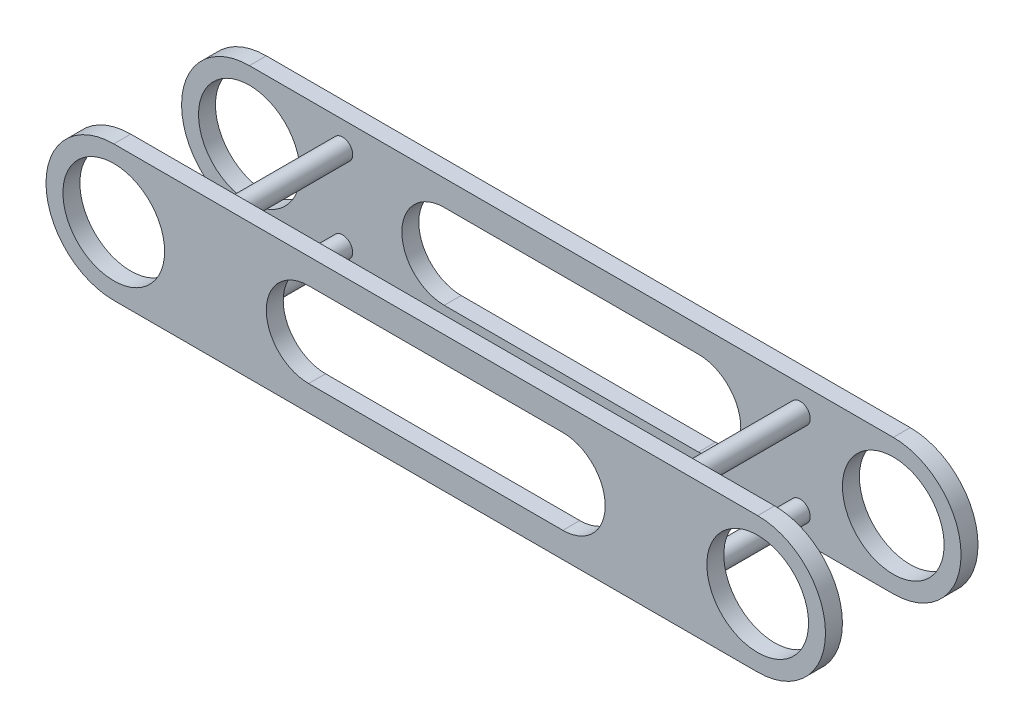
ISO-10303-21;
HEADER;
FILE_DESCRIPTION(('STEP AP214'),'2;1');
FILE_NAME('part.step','',(''),(''),'','','');
FILE_SCHEMA(('AUTOMOTIVE_DESIGN { 1 0 10303 214 1 1 1 1 }'));
ENDSEC;
DATA;
#1=APPLICATION_CONTEXT('core data for automotive mechanical design processes');
#2=APPLICATION_PROTOCOL_DEFINITION('international standard','automotive_design',2000,#1);
#3=PRODUCT_CONTEXT('',#1,'mechanical');
#4=PRODUCT('Part','Part','',(#3));
#5=PRODUCT_RELATED_PRODUCT_CATEGORY('part','',(#4));
#6=PRODUCT_DEFINITION_FORMATION('','',#4);
#7=PRODUCT_DEFINITION_CONTEXT('part definition',#1,'design');
#8=PRODUCT_DEFINITION('design','',#6,#7);
#9=PRODUCT_DEFINITION_SHAPE('','',#8);
#10=(LENGTH_UNIT() NAMED_UNIT(*) SI_UNIT(.MILLI.,.METRE.));
#11=(NAMED_UNIT(*) PLANE_ANGLE_UNIT() SI_UNIT($,.RADIAN.));
#12=(NAMED_UNIT(*) SI_UNIT($,.STERADIAN.) SOLID_ANGLE_UNIT());
#13=UNCERTAINTY_MEASURE_WITH_UNIT(LENGTH_MEASURE(1.E-05),#10,'distance_accuracy_value','');
#14=(GEOMETRIC_REPRESENTATION_CONTEXT(3) GLOBAL_UNCERTAINTY_ASSIGNED_CONTEXT((#13)) GLOBAL_UNIT_ASSIGNED_CONTEXT((#10,
#11,#12)) REPRESENTATION_CONTEXT('',''));
#15=CARTESIAN_POINT('',(0.,0.,0.));
#16=DIRECTION('',(0.,0.,1.));
#17=DIRECTION('',(1.,0.,0.));
#18=AXIS2_PLACEMENT_3D('',#15,#16,#17);
#19=CARTESIAN_POINT('',(380.,0.,-35.));
#20=DIRECTION('',(0.,0.,-1.));
#21=DIRECTION('',(1.,0.,0.));
#22=AXIS2_PLACEMENT_3D('',#19,#20,#21);
#23=PLANE('',#22);
#24=CARTESIAN_POINT('',(325.,25.,-35.));
#25=DIRECTION('',(0.,0.,-1.));
#26=DIRECTION('',(-1.,0.,0.));
#27=AXIS2_PLACEMENT_3D('',#24,#25,#26);
#28=CIRCLE('',#27,5.99999999999999);
#29=CARTESIAN_POINT('',(319.,25.,-35.));
#30=VERTEX_POINT('',#29);
#31=EDGE_CURVE('E433',#30,#30,#28,.F.);
#32=ORIENTED_EDGE('',*,*,#31,.F.);
#33=EDGE_LOOP('',(#32));
#34=FACE_BOUND('',#33,.T.);
#35=CARTESIAN_POINT('',(325.,-25.,-35.));
#36=DIRECTION('',(0.,0.,-1.));
#37=DIRECTION('',(-1.,0.,0.));
#38=AXIS2_PLACEMENT_3D('',#35,#36,#37);
#39=CIRCLE('',#38,5.99999999999999);
#40=CARTESIAN_POINT('',(319.,-25.,-35.));
#41=VERTEX_POINT('',#40);
#42=EDGE_CURVE('E441',#41,#41,#39,.F.);
#43=ORIENTED_EDGE('',*,*,#42,.F.);
#44=EDGE_LOOP('',(#43));
#45=FACE_BOUND('',#44,.T.);
#46=CARTESIAN_POINT('',(55.,-25.,-35.));
#47=DIRECTION('',(0.,0.,-1.));
#48=DIRECTION('',(-1.,0.,0.));
#49=AXIS2_PLACEMENT_3D('',#46,#47,#48);
#50=CIRCLE('',#49,6.);
#51=CARTESIAN_POINT('',(49.,-25.,-35.));
#52=VERTEX_POINT('',#51);
#53=EDGE_CURVE('E449',#52,#52,#50,.F.);
#54=ORIENTED_EDGE('',*,*,#53,.F.);
#55=EDGE_LOOP('',(#54));
#56=FACE_BOUND('',#55,.T.);
#57=CARTESIAN_POINT('',(55.,25.,-35.));
#58=DIRECTION('',(0.,0.,-1.));
#59=DIRECTION('',(-1.,0.,0.));
#60=AXIS2_PLACEMENT_3D('',#57,#58,#59);
#61=CIRCLE('',#60,6.);
#62=CARTESIAN_POINT('',(49.,25.,-35.));
#63=VERTEX_POINT('',#62);
#64=EDGE_CURVE('E457',#63,#63,#61,.F.);
#65=ORIENTED_EDGE('',*,*,#64,.F.);
#66=EDGE_LOOP('',(#65));
#67=FACE_BOUND('',#66,.T.);
#68=CARTESIAN_POINT('',(380.,0.,-35.));
#69=DIRECTION('',(0.,0.,1.));
#70=DIRECTION('',(1.,0.,0.));
#71=AXIS2_PLACEMENT_3D('',#68,#69,#70);
#72=CIRCLE('',#71,40.);
#73=CARTESIAN_POINT('',(380.,-40.,-35.));
#74=VERTEX_POINT('',#73);
#75=CARTESIAN_POINT('',(380.,40.,-35.));
#76=VERTEX_POINT('',#75);
#77=EDGE_CURVE('E201',#74,#76,#72,.T.);
#78=ORIENTED_EDGE('',*,*,#77,.T.);
#79=DIRECTION('',(-1.,0.,0.));
#80=VECTOR('',#79,1.);
#81=CARTESIAN_POINT('',(0.,40.,-35.));
#82=LINE('',#81,#80);
#83=CARTESIAN_POINT('',(0.,40.,-35.));
#84=VERTEX_POINT('',#83);
#85=EDGE_CURVE('E212',#76,#84,#82,.T.);
#86=ORIENTED_EDGE('',*,*,#85,.T.);
#87=CARTESIAN_POINT('',(0.,0.,-35.));
#88=DIRECTION('',(0.,0.,1.));
#89=DIRECTION('',(1.,0.,0.));
#90=AXIS2_PLACEMENT_3D('',#87,#88,#89);
#91=CIRCLE('',#90,40.);
#92=CARTESIAN_POINT('',(0.,-40.,-35.));
#93=VERTEX_POINT('',#92);
#94=EDGE_CURVE('E209',#84,#93,#91,.T.);
#95=ORIENTED_EDGE('',*,*,#94,.T.);
#96=DIRECTION('',(1.,0.,0.));
#97=VECTOR('',#96,1.);
#98=CARTESIAN_POINT('',(0.,-40.,-35.));
#99=LINE('',#98,#97);
#100=EDGE_CURVE('E205',#93,#74,#99,.T.);
#101=ORIENTED_EDGE('',*,*,#100,.T.);
#102=EDGE_LOOP('',(#78,#86,#95,#101));
#103=FACE_BOUND('',#102,.T.);
#104=CARTESIAN_POINT('',(380.,0.,-35.));
#105=DIRECTION('',(0.,0.,-1.));
#106=DIRECTION('',(-1.,0.,0.));
#107=AXIS2_PLACEMENT_3D('',#104,#105,#106);
#108=CIRCLE('',#107,30.);
#109=CARTESIAN_POINT('',(350.,0.,-35.));
#110=VERTEX_POINT('',#109);
#111=EDGE_CURVE('E414',#110,#110,#108,.T.);
#112=ORIENTED_EDGE('',*,*,#111,.T.);
#113=EDGE_LOOP('',(#112));
#114=FACE_BOUND('',#113,.T.);
#115=CARTESIAN_POINT('',(0.,0.,-35.));
#116=DIRECTION('',(0.,0.,-1.));
#117=DIRECTION('',(-1.,0.,0.));
#118=AXIS2_PLACEMENT_3D('',#115,#116,#117);
#119=CIRCLE('',#118,30.);
#120=CARTESIAN_POINT('',(-30.,0.,-35.));
#121=VERTEX_POINT('',#120);
#122=EDGE_CURVE('E429',#121,#121,#119,.T.);
#123=ORIENTED_EDGE('',*,*,#122,.T.);
#124=EDGE_LOOP('',(#123));
#125=FACE_BOUND('',#124,.T.);
#126=CARTESIAN_POINT('',(265.,0.,-35.));
#127=DIRECTION('',(0.,0.,-1.));
#128=DIRECTION('',(-1.,0.,0.));
#129=AXIS2_PLACEMENT_3D('',#126,#127,#128);
#130=CIRCLE('',#129,25.);
#131=CARTESIAN_POINT('',(265.,25.,-35.));
#132=VERTEX_POINT('',#131);
#133=CARTESIAN_POINT('',(265.,-25.,-35.));
#134=VERTEX_POINT('',#133);
#135=EDGE_CURVE('E168',#132,#134,#130,.T.);
#136=ORIENTED_EDGE('',*,*,#135,.T.);
#137=DIRECTION('',(-1.,0.,0.));
#138=VECTOR('',#137,1.);
#139=CARTESIAN_POINT('',(265.,-25.,-35.));
#140=LINE('',#139,#138);
#141=CARTESIAN_POINT('',(115.,-25.0000000000001,-35.));
#142=VERTEX_POINT('',#141);
#143=EDGE_CURVE('E156',#134,#142,#140,.T.);
#144=ORIENTED_EDGE('',*,*,#143,.T.);
#145=CARTESIAN_POINT('',(115.,0.,-35.));
#146=DIRECTION('',(0.,0.,-1.));
#147=DIRECTION('',(-1.,0.,0.));
#148=AXIS2_PLACEMENT_3D('',#145,#146,#147);
#149=CIRCLE('',#148,25.);
#150=CARTESIAN_POINT('',(115.,25.,-35.));
#151=VERTEX_POINT('',#150);
#152=EDGE_CURVE('E181',#142,#151,#149,.T.);
#153=ORIENTED_EDGE('',*,*,#152,.T.);
#154=DIRECTION('',(1.,0.,0.));
#155=VECTOR('',#154,1.);
#156=CARTESIAN_POINT('',(265.,25.,-35.));
#157=LINE('',#156,#155);
#158=EDGE_CURVE('E174',#151,#132,#157,.T.);
#159=ORIENTED_EDGE('',*,*,#158,.T.);
#160=EDGE_LOOP('',(#136,#144,#153,#159));
#161=FACE_BOUND('',#160,.T.);
#162=ADVANCED_FACE('F42',(#34,#45,#56,#67,#103,#114,#125,#161),#23,.F.);
#163=CARTESIAN_POINT('',(380.,0.,-45.));
#164=DIRECTION('',(0.,0.,-1.));
#165=DIRECTION('',(1.,0.,0.));
#166=AXIS2_PLACEMENT_3D('',#163,#164,#165);
#167=PLANE('',#166);
#168=CARTESIAN_POINT('',(0.,0.,-45.));
#169=DIRECTION('',(0.,0.,-1.));
#170=DIRECTION('',(-1.,0.,0.));
#171=AXIS2_PLACEMENT_3D('',#168,#169,#170);
#172=CIRCLE('',#171,30.);
#173=CARTESIAN_POINT('',(-30.,0.,-45.));
#174=VERTEX_POINT('',#173);
#175=EDGE_CURVE('E419',#174,#174,#172,.T.);
#176=ORIENTED_EDGE('',*,*,#175,.F.);
#177=EDGE_LOOP('',(#176));
#178=FACE_BOUND('',#177,.T.);
#179=CARTESIAN_POINT('',(380.,0.,-45.));
#180=DIRECTION('',(0.,0.,-1.));
#181=DIRECTION('',(-1.,0.,0.));
#182=AXIS2_PLACEMENT_3D('',#179,#180,#181);
#183=CIRCLE('',#182,30.);
#184=CARTESIAN_POINT('',(350.,0.,-45.));
#185=VERTEX_POINT('',#184);
#186=EDGE_CURVE('E422',#185,#185,#183,.T.);
#187=ORIENTED_EDGE('',*,*,#186,.F.);
#188=EDGE_LOOP('',(#187));
#189=FACE_BOUND('',#188,.T.);
#190=CARTESIAN_POINT('',(380.,0.,-45.));
#191=DIRECTION('',(0.,0.,1.));
#192=DIRECTION('',(1.,0.,0.));
#193=AXIS2_PLACEMENT_3D('',#190,#191,#192);
#194=CIRCLE('',#193,40.);
#195=CARTESIAN_POINT('',(380.,-40.,-45.));
#196=VERTEX_POINT('',#195);
#197=CARTESIAN_POINT('',(380.,40.,-45.));
#198=VERTEX_POINT('',#197);
#199=EDGE_CURVE('E164',#196,#198,#194,.T.);
#200=ORIENTED_EDGE('',*,*,#199,.F.);
#201=DIRECTION('',(1.,0.,0.));
#202=VECTOR('',#201,1.);
#203=CARTESIAN_POINT('',(0.,-40.,-45.));
#204=LINE('',#203,#202);
#205=CARTESIAN_POINT('',(0.,-40.,-45.));
#206=VERTEX_POINT('',#205);
#207=EDGE_CURVE('E219',#206,#196,#204,.T.);
#208=ORIENTED_EDGE('',*,*,#207,.F.);
#209=CARTESIAN_POINT('',(0.,0.,-45.));
#210=DIRECTION('',(0.,0.,1.));
#211=DIRECTION('',(1.,0.,0.));
#212=AXIS2_PLACEMENT_3D('',#209,#210,#211);
#213=CIRCLE('',#212,40.);
#214=CARTESIAN_POINT('',(0.,40.,-45.));
#215=VERTEX_POINT('',#214);
#216=EDGE_CURVE('E222',#215,#206,#213,.T.);
#217=ORIENTED_EDGE('',*,*,#216,.F.);
#218=DIRECTION('',(-1.,0.,0.));
#219=VECTOR('',#218,1.);
#220=CARTESIAN_POINT('',(0.,40.,-45.));
#221=LINE('',#220,#219);
#222=EDGE_CURVE('E206',#198,#215,#221,.T.);
#223=ORIENTED_EDGE('',*,*,#222,.F.);
#224=EDGE_LOOP('',(#200,#208,#217,#223));
#225=FACE_BOUND('',#224,.T.);
#226=DIRECTION('',(1.,0.,0.));
#227=VECTOR('',#226,1.);
#228=CARTESIAN_POINT('',(265.,-25.,-45.));
#229=LINE('',#228,#227);
#230=CARTESIAN_POINT('',(115.,-25.0000000000001,-45.));
#231=VERTEX_POINT('',#230);
#232=CARTESIAN_POINT('',(265.,-25.,-45.));
#233=VERTEX_POINT('',#232);
#234=EDGE_CURVE('E179',#231,#233,#229,.T.);
#235=ORIENTED_EDGE('',*,*,#234,.T.);
#236=CARTESIAN_POINT('',(265.,0.,-45.));
#237=DIRECTION('',(0.,0.,1.));
#238=DIRECTION('',(1.,0.,0.));
#239=AXIS2_PLACEMENT_3D('',#236,#237,#238);
#240=CIRCLE('',#239,25.);
#241=CARTESIAN_POINT('',(265.,25.,-45.));
#242=VERTEX_POINT('',#241);
#243=EDGE_CURVE('E68',#233,#242,#240,.T.);
#244=ORIENTED_EDGE('',*,*,#243,.T.);
#245=DIRECTION('',(-1.,0.,0.));
#246=VECTOR('',#245,1.);
#247=CARTESIAN_POINT('',(265.,25.,-45.));
#248=LINE('',#247,#246);
#249=CARTESIAN_POINT('',(115.,25.,-45.));
#250=VERTEX_POINT('',#249);
#251=EDGE_CURVE('E171',#242,#250,#248,.T.);
#252=ORIENTED_EDGE('',*,*,#251,.T.);
#253=CARTESIAN_POINT('',(115.,0.,-45.));
#254=DIRECTION('',(0.,0.,1.));
#255=DIRECTION('',(1.,0.,0.));
#256=AXIS2_PLACEMENT_3D('',#253,#254,#255);
#257=CIRCLE('',#256,25.);
#258=EDGE_CURVE('E187',#250,#231,#257,.T.);
#259=ORIENTED_EDGE('',*,*,#258,.T.);
#260=EDGE_LOOP('',(#235,#244,#252,#259));
#261=FACE_BOUND('',#260,.T.);
#262=ADVANCED_FACE('F348',(#178,#189,#225,#261),#167,.T.);
#263=CARTESIAN_POINT('',(380.,0.,35.));
#264=DIRECTION('',(0.,0.,1.));
#265=DIRECTION('',(1.,0.,0.));
#266=AXIS2_PLACEMENT_3D('',#263,#264,#265);
#267=CYLINDRICAL_SURFACE('',#266,40.);
#268=CARTESIAN_POINT('',(380.,0.,45.));
#269=DIRECTION('',(0.,0.,1.));
#270=DIRECTION('',(1.,0.,0.));
#271=AXIS2_PLACEMENT_3D('',#268,#269,#270);
#272=CIRCLE('',#271,40.);
#273=CARTESIAN_POINT('',(380.,-40.,45.));
#274=VERTEX_POINT('',#273);
#275=CARTESIAN_POINT('',(380.,40.,45.));
#276=VERTEX_POINT('',#275);
#277=EDGE_CURVE('E285',#274,#276,#272,.T.);
#278=ORIENTED_EDGE('',*,*,#277,.F.);
#279=DIRECTION('',(0.,0.,1.));
#280=VECTOR('',#279,1.);
#281=CARTESIAN_POINT('',(380.,-40.,35.));
#282=LINE('',#281,#280);
#283=CARTESIAN_POINT('',(380.,-40.,35.));
#284=VERTEX_POINT('',#283);
#285=EDGE_CURVE('E11',#284,#274,#282,.T.);
#286=ORIENTED_EDGE('',*,*,#285,.F.);
#287=CARTESIAN_POINT('',(380.,0.,35.));
#288=DIRECTION('',(0.,0.,1.));
#289=DIRECTION('',(1.,0.,0.));
#290=AXIS2_PLACEMENT_3D('',#287,#288,#289);
#291=CIRCLE('',#290,40.);
#292=CARTESIAN_POINT('',(380.,40.,35.));
#293=VERTEX_POINT('',#292);
#294=EDGE_CURVE('E286',#284,#293,#291,.T.);
#295=ORIENTED_EDGE('',*,*,#294,.T.);
#296=DIRECTION('',(0.,0.,1.));
#297=VECTOR('',#296,1.);
#298=CARTESIAN_POINT('',(380.,40.,35.));
#299=LINE('',#298,#297);
#300=EDGE_CURVE('E46',#293,#276,#299,.T.);
#301=ORIENTED_EDGE('',*,*,#300,.T.);
#302=EDGE_LOOP('',(#278,#286,#295,#301));
#303=FACE_BOUND('',#302,.T.);
#304=ADVANCED_FACE('F44',(#303),#267,.T.);
#305=CARTESIAN_POINT('',(0.,-40.,35.));
#306=DIRECTION('',(0.,-1.,0.));
#307=DIRECTION('',(1.,0.,0.));
#308=AXIS2_PLACEMENT_3D('',#305,#306,#307);
#309=PLANE('',#308);
#310=DIRECTION('',(1.,0.,0.));
#311=VECTOR('',#310,1.);
#312=CARTESIAN_POINT('',(0.,-40.,45.));
#313=LINE('',#312,#311);
#314=CARTESIAN_POINT('',(0.,-40.,45.));
#315=VERTEX_POINT('',#314);
#316=EDGE_CURVE('E291',#315,#274,#313,.T.);
#317=ORIENTED_EDGE('',*,*,#316,.F.);
#318=DIRECTION('',(0.,0.,1.));
#319=VECTOR('',#318,1.);
#320=CARTESIAN_POINT('',(0.,-40.,35.));
#321=LINE('',#320,#319);
#322=CARTESIAN_POINT('',(0.,-40.,35.));
#323=VERTEX_POINT('',#322);
#324=EDGE_CURVE('E52',#323,#315,#321,.T.);
#325=ORIENTED_EDGE('',*,*,#324,.F.);
#326=DIRECTION('',(1.,0.,0.));
#327=VECTOR('',#326,1.);
#328=CARTESIAN_POINT('',(0.,-40.,35.));
#329=LINE('',#328,#327);
#330=EDGE_CURVE('E299',#323,#284,#329,.T.);
#331=ORIENTED_EDGE('',*,*,#330,.T.);
#332=ORIENTED_EDGE('',*,*,#285,.T.);
#333=EDGE_LOOP('',(#317,#325,#331,#332));
#334=FACE_BOUND('',#333,.T.);
#335=ADVANCED_FACE('F333',(#334),#309,.T.);
#336=CARTESIAN_POINT('',(0.,0.,35.));
#337=DIRECTION('',(0.,0.,1.));
#338=DIRECTION('',(1.,0.,0.));
#339=AXIS2_PLACEMENT_3D('',#336,#337,#338);
#340=CYLINDRICAL_SURFACE('',#339,40.);
#341=CARTESIAN_POINT('',(0.,0.,45.));
#342=DIRECTION('',(0.,0.,1.));
#343=DIRECTION('',(1.,0.,0.));
#344=AXIS2_PLACEMENT_3D('',#341,#342,#343);
#345=CIRCLE('',#344,40.);
#346=CARTESIAN_POINT('',(0.,40.,45.));
#347=VERTEX_POINT('',#346);
#348=EDGE_CURVE('E310',#347,#315,#345,.T.);
#349=ORIENTED_EDGE('',*,*,#348,.F.);
#350=DIRECTION('',(0.,0.,1.));
#351=VECTOR('',#350,1.);
#352=CARTESIAN_POINT('',(0.,40.,35.));
#353=LINE('',#352,#351);
#354=CARTESIAN_POINT('',(0.,40.,35.));
#355=VERTEX_POINT('',#354);
#356=EDGE_CURVE('E318',#355,#347,#353,.T.);
#357=ORIENTED_EDGE('',*,*,#356,.F.);
#358=CARTESIAN_POINT('',(0.,0.,35.));
#359=DIRECTION('',(0.,0.,1.));
#360=DIRECTION('',(1.,0.,0.));
#361=AXIS2_PLACEMENT_3D('',#358,#359,#360);
#362=CIRCLE('',#361,40.);
#363=EDGE_CURVE('E295',#355,#323,#362,.T.);
#364=ORIENTED_EDGE('',*,*,#363,.T.);
#365=ORIENTED_EDGE('',*,*,#324,.T.);
#366=EDGE_LOOP('',(#349,#357,#364,#365));
#367=FACE_BOUND('',#366,.T.);
#368=ADVANCED_FACE('F339',(#367),#340,.T.);
#369=CARTESIAN_POINT('',(0.,40.,35.));
#370=DIRECTION('',(0.,1.,0.));
#371=DIRECTION('',(0.,0.,1.));
#372=AXIS2_PLACEMENT_3D('',#369,#370,#371);
#373=PLANE('',#372);
#374=DIRECTION('',(-1.,0.,0.));
#375=VECTOR('',#374,1.);
#376=CARTESIAN_POINT('',(0.,40.,45.));
#377=LINE('',#376,#375);
#378=EDGE_CURVE('E306',#276,#347,#377,.T.);
#379=ORIENTED_EDGE('',*,*,#378,.F.);
#380=ORIENTED_EDGE('',*,*,#300,.F.);
#381=DIRECTION('',(-1.,0.,0.));
#382=VECTOR('',#381,1.);
#383=CARTESIAN_POINT('',(0.,40.,35.));
#384=LINE('',#383,#382);
#385=EDGE_CURVE('E290',#293,#355,#384,.T.);
#386=ORIENTED_EDGE('',*,*,#385,.T.);
#387=ORIENTED_EDGE('',*,*,#356,.T.);
#388=EDGE_LOOP('',(#379,#380,#386,#387));
#389=FACE_BOUND('',#388,.T.);
#390=ADVANCED_FACE('F328',(#389),#373,.T.);
#391=CARTESIAN_POINT('',(380.,0.,35.));
#392=DIRECTION('',(0.,0.,1.));
#393=DIRECTION('',(1.,0.,0.));
#394=AXIS2_PLACEMENT_3D('',#391,#392,#393);
#395=PLANE('',#394);
#396=CARTESIAN_POINT('',(325.,25.,35.));
#397=DIRECTION('',(0.,0.,1.));
#398=DIRECTION('',(1.,0.,0.));
#399=AXIS2_PLACEMENT_3D('',#396,#397,#398);
#400=CIRCLE('',#399,5.99999999999999);
#401=CARTESIAN_POINT('',(331.,25.,35.));
#402=VERTEX_POINT('',#401);
#403=EDGE_CURVE('E437',#402,#402,#400,.T.);
#404=ORIENTED_EDGE('',*,*,#403,.T.);
#405=EDGE_LOOP('',(#404));
#406=FACE_BOUND('',#405,.T.);
#407=CARTESIAN_POINT('',(325.,-25.,35.));
#408=DIRECTION('',(0.,0.,1.));
#409=DIRECTION('',(1.,0.,0.));
#410=AXIS2_PLACEMENT_3D('',#407,#408,#409);
#411=CIRCLE('',#410,5.99999999999999);
#412=CARTESIAN_POINT('',(331.,-25.,35.));
#413=VERTEX_POINT('',#412);
#414=EDGE_CURVE('E445',#413,#413,#411,.T.);
#415=ORIENTED_EDGE('',*,*,#414,.T.);
#416=EDGE_LOOP('',(#415));
#417=FACE_BOUND('',#416,.T.);
#418=CARTESIAN_POINT('',(55.,-25.,35.));
#419=DIRECTION('',(0.,0.,1.));
#420=DIRECTION('',(1.,0.,0.));
#421=AXIS2_PLACEMENT_3D('',#418,#419,#420);
#422=CIRCLE('',#421,6.);
#423=CARTESIAN_POINT('',(61.,-25.,35.));
#424=VERTEX_POINT('',#423);
#425=EDGE_CURVE('E453',#424,#424,#422,.T.);
#426=ORIENTED_EDGE('',*,*,#425,.T.);
#427=EDGE_LOOP('',(#426));
#428=FACE_BOUND('',#427,.T.);
#429=CARTESIAN_POINT('',(55.,25.,35.));
#430=DIRECTION('',(0.,0.,1.));
#431=DIRECTION('',(1.,0.,0.));
#432=AXIS2_PLACEMENT_3D('',#429,#430,#431);
#433=CIRCLE('',#432,6.);
#434=CARTESIAN_POINT('',(61.,25.,35.));
#435=VERTEX_POINT('',#434);
#436=EDGE_CURVE('E461',#435,#435,#433,.T.);
#437=ORIENTED_EDGE('',*,*,#436,.T.);
#438=EDGE_LOOP('',(#437));
#439=FACE_BOUND('',#438,.T.);
#440=CARTESIAN_POINT('',(380.,0.,35.));
#441=DIRECTION('',(0.,0.,1.));
#442=DIRECTION('',(1.,0.,0.));
#443=AXIS2_PLACEMENT_3D('',#440,#441,#442);
#444=CIRCLE('',#443,30.);
#445=CARTESIAN_POINT('',(410.,0.,35.));
#446=VERTEX_POINT('',#445);
#447=EDGE_CURVE('E502',#446,#446,#444,.T.);
#448=ORIENTED_EDGE('',*,*,#447,.T.);
#449=EDGE_LOOP('',(#448));
#450=FACE_BOUND('',#449,.T.);
#451=DIRECTION('',(-1.,0.,0.));
#452=VECTOR('',#451,1.);
#453=CARTESIAN_POINT('',(265.,-25.,35.));
#454=LINE('',#453,#452);
#455=CARTESIAN_POINT('',(265.,-25.,35.));
#456=VERTEX_POINT('',#455);
#457=CARTESIAN_POINT('',(115.,-25.0000000000001,35.));
#458=VERTEX_POINT('',#457);
#459=EDGE_CURVE('E245',#456,#458,#454,.T.);
#460=ORIENTED_EDGE('',*,*,#459,.F.);
#461=CARTESIAN_POINT('',(265.,0.,35.));
#462=DIRECTION('',(0.,0.,1.));
#463=DIRECTION('',(1.,0.,0.));
#464=AXIS2_PLACEMENT_3D('',#461,#462,#463);
#465=CIRCLE('',#464,25.);
#466=CARTESIAN_POINT('',(265.,25.,35.));
#467=VERTEX_POINT('',#466);
#468=EDGE_CURVE('E249',#467,#456,#465,.F.);
#469=ORIENTED_EDGE('',*,*,#468,.F.);
#470=DIRECTION('',(1.,0.,0.));
#471=VECTOR('',#470,1.);
#472=CARTESIAN_POINT('',(265.,25.,35.));
#473=LINE('',#472,#471);
#474=CARTESIAN_POINT('',(115.,25.,35.));
#475=VERTEX_POINT('',#474);
#476=EDGE_CURVE('E272',#475,#467,#473,.T.);
#477=ORIENTED_EDGE('',*,*,#476,.F.);
#478=CARTESIAN_POINT('',(115.,0.,35.));
#479=DIRECTION('',(0.,0.,1.));
#480=DIRECTION('',(1.,0.,0.));
#481=AXIS2_PLACEMENT_3D('',#478,#479,#480);
#482=CIRCLE('',#481,25.);
#483=EDGE_CURVE('E231',#458,#475,#482,.F.);
#484=ORIENTED_EDGE('',*,*,#483,.F.);
#485=EDGE_LOOP('',(#460,#469,#477,#484));
#486=FACE_BOUND('',#485,.T.);
#487=CARTESIAN_POINT('',(0.,0.,35.));
#488=DIRECTION('',(0.,0.,1.));
#489=DIRECTION('',(1.,0.,0.));
#490=AXIS2_PLACEMENT_3D('',#487,#488,#489);
#491=CIRCLE('',#490,30.);
#492=CARTESIAN_POINT('',(30.,0.,35.));
#493=VERTEX_POINT('',#492);
#494=EDGE_CURVE('E413',#493,#493,#491,.T.);
#495=ORIENTED_EDGE('',*,*,#494,.T.);
#496=EDGE_LOOP('',(#495));
#497=FACE_BOUND('',#496,.T.);
#498=ORIENTED_EDGE('',*,*,#294,.F.);
#499=ORIENTED_EDGE('',*,*,#330,.F.);
#500=ORIENTED_EDGE('',*,*,#363,.F.);
#501=ORIENTED_EDGE('',*,*,#385,.F.);
#502=EDGE_LOOP('',(#498,#499,#500,#501));
#503=FACE_BOUND('',#502,.T.);
#504=ADVANCED_FACE('F336',(#406,#417,#428,#439,#450,#486,#497,#503),#395,.F.);
#505=CARTESIAN_POINT('',(380.,0.,45.));
#506=DIRECTION('',(0.,0.,1.));
#507=DIRECTION('',(1.,0.,0.));
#508=AXIS2_PLACEMENT_3D('',#505,#506,#507);
#509=PLANE('',#508);
#510=CARTESIAN_POINT('',(380.,0.,45.));
#511=DIRECTION('',(0.,0.,1.));
#512=DIRECTION('',(1.,0.,0.));
#513=AXIS2_PLACEMENT_3D('',#510,#511,#512);
#514=CIRCLE('',#513,30.);
#515=CARTESIAN_POINT('',(410.,0.,45.));
#516=VERTEX_POINT('',#515);
#517=EDGE_CURVE('E403',#516,#516,#514,.T.);
#518=ORIENTED_EDGE('',*,*,#517,.F.);
#519=EDGE_LOOP('',(#518));
#520=FACE_BOUND('',#519,.T.);
#521=CARTESIAN_POINT('',(265.,0.,45.));
#522=DIRECTION('',(0.,0.,1.));
#523=DIRECTION('',(1.,0.,0.));
#524=AXIS2_PLACEMENT_3D('',#521,#522,#523);
#525=CIRCLE('',#524,25.);
#526=CARTESIAN_POINT('',(265.,-25.,45.));
#527=VERTEX_POINT('',#526);
#528=CARTESIAN_POINT('',(265.,25.,45.));
#529=VERTEX_POINT('',#528);
#530=EDGE_CURVE('E253',#527,#529,#525,.T.);
#531=ORIENTED_EDGE('',*,*,#530,.F.);
#532=DIRECTION('',(1.,0.,0.));
#533=VECTOR('',#532,1.);
#534=CARTESIAN_POINT('',(265.,-25.,45.));
#535=LINE('',#534,#533);
#536=CARTESIAN_POINT('',(115.,-25.0000000000001,45.));
#537=VERTEX_POINT('',#536);
#538=EDGE_CURVE('E264',#537,#527,#535,.T.);
#539=ORIENTED_EDGE('',*,*,#538,.F.);
#540=CARTESIAN_POINT('',(115.,0.,45.));
#541=DIRECTION('',(0.,0.,1.));
#542=DIRECTION('',(1.,0.,0.));
#543=AXIS2_PLACEMENT_3D('',#540,#541,#542);
#544=CIRCLE('',#543,25.);
#545=CARTESIAN_POINT('',(115.,25.,45.));
#546=VERTEX_POINT('',#545);
#547=EDGE_CURVE('E260',#546,#537,#544,.T.);
#548=ORIENTED_EDGE('',*,*,#547,.F.);
#549=DIRECTION('',(-1.,0.,0.));
#550=VECTOR('',#549,1.);
#551=CARTESIAN_POINT('',(265.,25.,45.));
#552=LINE('',#551,#550);
#553=EDGE_CURVE('E256',#529,#546,#552,.T.);
#554=ORIENTED_EDGE('',*,*,#553,.F.);
#555=EDGE_LOOP('',(#531,#539,#548,#554));
#556=FACE_BOUND('',#555,.T.);
#557=CARTESIAN_POINT('',(0.,0.,45.));
#558=DIRECTION('',(0.,0.,1.));
#559=DIRECTION('',(1.,0.,0.));
#560=AXIS2_PLACEMENT_3D('',#557,#558,#559);
#561=CIRCLE('',#560,30.);
#562=CARTESIAN_POINT('',(30.,0.,45.));
#563=VERTEX_POINT('',#562);
#564=EDGE_CURVE('E410',#563,#563,#561,.T.);
#565=ORIENTED_EDGE('',*,*,#564,.F.);
#566=EDGE_LOOP('',(#565));
#567=FACE_BOUND('',#566,.T.);
#568=ORIENTED_EDGE('',*,*,#277,.T.);
#569=ORIENTED_EDGE('',*,*,#378,.T.);
#570=ORIENTED_EDGE('',*,*,#348,.T.);
#571=ORIENTED_EDGE('',*,*,#316,.T.);
#572=EDGE_LOOP('',(#568,#569,#570,#571));
#573=FACE_BOUND('',#572,.T.);
#574=ADVANCED_FACE('F330',(#520,#556,#567,#573),#509,.T.);
#575=CARTESIAN_POINT('',(265.,0.,-52.501));
#576=DIRECTION('',(0.,0.,1.));
#577=DIRECTION('',(1.,0.,0.));
#578=AXIS2_PLACEMENT_3D('',#575,#576,#577);
#579=CYLINDRICAL_SURFACE('',#578,25.);
#580=ORIENTED_EDGE('',*,*,#468,.T.);
#581=DIRECTION('',(0.,0.,1.));
#582=VECTOR('',#581,1.);
#583=CARTESIAN_POINT('',(265.,-25.,-52.501));
#584=LINE('',#583,#582);
#585=EDGE_CURVE('E269',#456,#527,#584,.T.);
#586=ORIENTED_EDGE('',*,*,#585,.T.);
#587=ORIENTED_EDGE('',*,*,#530,.T.);
#588=DIRECTION('',(0.,0.,1.));
#589=VECTOR('',#588,1.);
#590=CARTESIAN_POINT('',(265.,25.,-52.501));
#591=LINE('',#590,#589);
#592=EDGE_CURVE('E268',#467,#529,#591,.T.);
#593=ORIENTED_EDGE('',*,*,#592,.F.);
#594=EDGE_LOOP('',(#580,#586,#587,#593));
#595=FACE_BOUND('',#594,.T.);
#596=ADVANCED_FACE('F382',(#595),#579,.F.);
#597=CARTESIAN_POINT('',(265.,-25.,-52.501));
#598=DIRECTION('',(0.,-1.,0.));
#599=DIRECTION('',(1.,0.,0.));
#600=AXIS2_PLACEMENT_3D('',#597,#598,#599);
#601=PLANE('',#600);
#602=ORIENTED_EDGE('',*,*,#459,.T.);
#603=DIRECTION('',(0.,0.,1.));
#604=VECTOR('',#603,1.);
#605=CARTESIAN_POINT('',(115.,-25.0000000000001,-52.501));
#606=LINE('',#605,#604);
#607=EDGE_CURVE('E273',#458,#537,#606,.T.);
#608=ORIENTED_EDGE('',*,*,#607,.T.);
#609=ORIENTED_EDGE('',*,*,#538,.T.);
#610=ORIENTED_EDGE('',*,*,#585,.F.);
#611=EDGE_LOOP('',(#602,#608,#609,#610));
#612=FACE_BOUND('',#611,.T.);
#613=ADVANCED_FACE('F378',(#612),#601,.F.);
#614=CARTESIAN_POINT('',(115.,0.,-52.501));
#615=DIRECTION('',(0.,0.,1.));
#616=DIRECTION('',(1.,0.,0.));
#617=AXIS2_PLACEMENT_3D('',#614,#615,#616);
#618=CYLINDRICAL_SURFACE('',#617,25.);
#619=ORIENTED_EDGE('',*,*,#483,.T.);
#620=DIRECTION('',(0.,0.,1.));
#621=VECTOR('',#620,1.);
#622=CARTESIAN_POINT('',(115.,25.,-52.501));
#623=LINE('',#622,#621);
#624=EDGE_CURVE('E276',#475,#546,#623,.T.);
#625=ORIENTED_EDGE('',*,*,#624,.T.);
#626=ORIENTED_EDGE('',*,*,#547,.T.);
#627=ORIENTED_EDGE('',*,*,#607,.F.);
#628=EDGE_LOOP('',(#619,#625,#626,#627));
#629=FACE_BOUND('',#628,.T.);
#630=ADVANCED_FACE('F381',(#629),#618,.F.);
#631=CARTESIAN_POINT('',(265.,25.,-52.501));
#632=DIRECTION('',(0.,1.,0.));
#633=DIRECTION('',(-1.,0.,0.));
#634=AXIS2_PLACEMENT_3D('',#631,#632,#633);
#635=PLANE('',#634);
#636=ORIENTED_EDGE('',*,*,#476,.T.);
#637=ORIENTED_EDGE('',*,*,#592,.T.);
#638=ORIENTED_EDGE('',*,*,#553,.T.);
#639=ORIENTED_EDGE('',*,*,#624,.F.);
#640=EDGE_LOOP('',(#636,#637,#638,#639));
#641=FACE_BOUND('',#640,.T.);
#642=ADVANCED_FACE('F376',(#641),#635,.F.);
#643=CARTESIAN_POINT('',(380.,0.,-35.));
#644=DIRECTION('',(0.,0.,-1.));
#645=DIRECTION('',(-1.,0.,0.));
#646=AXIS2_PLACEMENT_3D('',#643,#644,#645);
#647=CYLINDRICAL_SURFACE('',#646,40.);
#648=ORIENTED_EDGE('',*,*,#199,.T.);
#649=DIRECTION('',(0.,0.,-1.));
#650=VECTOR('',#649,1.);
#651=CARTESIAN_POINT('',(380.,40.,-35.));
#652=LINE('',#651,#650);
#653=EDGE_CURVE('E227',#76,#198,#652,.T.);
#654=ORIENTED_EDGE('',*,*,#653,.F.);
#655=ORIENTED_EDGE('',*,*,#77,.F.);
#656=DIRECTION('',(0.,0.,-1.));
#657=VECTOR('',#656,1.);
#658=CARTESIAN_POINT('',(380.,-40.,-35.));
#659=LINE('',#658,#657);
#660=EDGE_CURVE('E215',#74,#196,#659,.T.);
#661=ORIENTED_EDGE('',*,*,#660,.T.);
#662=EDGE_LOOP('',(#648,#654,#655,#661));
#663=FACE_BOUND('',#662,.T.);
#664=ADVANCED_FACE('F365',(#663),#647,.T.);
#665=CARTESIAN_POINT('',(0.,40.,-35.));
#666=DIRECTION('',(0.,-1.,0.));
#667=DIRECTION('',(0.,0.,-1.));
#668=AXIS2_PLACEMENT_3D('',#665,#666,#667);
#669=PLANE('',#668);
#670=ORIENTED_EDGE('',*,*,#222,.T.);
#671=DIRECTION('',(0.,0.,-1.));
#672=VECTOR('',#671,1.);
#673=CARTESIAN_POINT('',(0.,40.,-35.));
#674=LINE('',#673,#672);
#675=EDGE_CURVE('E232',#84,#215,#674,.T.);
#676=ORIENTED_EDGE('',*,*,#675,.F.);
#677=ORIENTED_EDGE('',*,*,#85,.F.);
#678=ORIENTED_EDGE('',*,*,#653,.T.);
#679=EDGE_LOOP('',(#670,#676,#677,#678));
#680=FACE_BOUND('',#679,.T.);
#681=ADVANCED_FACE('F361',(#680),#669,.F.);
#682=CARTESIAN_POINT('',(0.,0.,-35.));
#683=DIRECTION('',(0.,0.,-1.));
#684=DIRECTION('',(-1.,0.,0.));
#685=AXIS2_PLACEMENT_3D('',#682,#683,#684);
#686=CYLINDRICAL_SURFACE('',#685,40.);
#687=ORIENTED_EDGE('',*,*,#216,.T.);
#688=DIRECTION('',(0.,0.,-1.));
#689=VECTOR('',#688,1.);
#690=CARTESIAN_POINT('',(0.,-40.,-35.));
#691=LINE('',#690,#689);
#692=EDGE_CURVE('E236',#93,#206,#691,.T.);
#693=ORIENTED_EDGE('',*,*,#692,.F.);
#694=ORIENTED_EDGE('',*,*,#94,.F.);
#695=ORIENTED_EDGE('',*,*,#675,.T.);
#696=EDGE_LOOP('',(#687,#693,#694,#695));
#697=FACE_BOUND('',#696,.T.);
#698=ADVANCED_FACE('F364',(#697),#686,.T.);
#699=CARTESIAN_POINT('',(0.,-40.,-35.));
#700=DIRECTION('',(0.,1.,0.));
#701=DIRECTION('',(-1.,0.,0.));
#702=AXIS2_PLACEMENT_3D('',#699,#700,#701);
#703=PLANE('',#702);
#704=ORIENTED_EDGE('',*,*,#207,.T.);
#705=ORIENTED_EDGE('',*,*,#660,.F.);
#706=ORIENTED_EDGE('',*,*,#100,.F.);
#707=ORIENTED_EDGE('',*,*,#692,.T.);
#708=EDGE_LOOP('',(#704,#705,#706,#707));
#709=FACE_BOUND('',#708,.T.);
#710=ADVANCED_FACE('F369',(#709),#703,.F.);
#711=CARTESIAN_POINT('',(265.,0.,52.501));
#712=DIRECTION('',(0.,0.,-1.));
#713=DIRECTION('',(-1.,0.,0.));
#714=AXIS2_PLACEMENT_3D('',#711,#712,#713);
#715=CYLINDRICAL_SURFACE('',#714,25.);
#716=DIRECTION('',(0.,0.,-1.));
#717=VECTOR('',#716,1.);
#718=CARTESIAN_POINT('',(265.,25.,52.501));
#719=LINE('',#718,#717);
#720=EDGE_CURVE('E165',#132,#242,#719,.T.);
#721=ORIENTED_EDGE('',*,*,#720,.T.);
#722=ORIENTED_EDGE('',*,*,#243,.F.);
#723=DIRECTION('',(0.,0.,-1.));
#724=VECTOR('',#723,1.);
#725=CARTESIAN_POINT('',(265.,-25.,52.501));
#726=LINE('',#725,#724);
#727=EDGE_CURVE('E158',#134,#233,#726,.T.);
#728=ORIENTED_EDGE('',*,*,#727,.F.);
#729=ORIENTED_EDGE('',*,*,#135,.F.);
#730=EDGE_LOOP('',(#721,#722,#728,#729));
#731=FACE_BOUND('',#730,.T.);
#732=ADVANCED_FACE('F167',(#731),#715,.F.);
#733=CARTESIAN_POINT('',(265.,25.,52.501));
#734=DIRECTION('',(0.,-1.,0.));
#735=DIRECTION('',(1.,0.,0.));
#736=AXIS2_PLACEMENT_3D('',#733,#734,#735);
#737=PLANE('',#736);
#738=DIRECTION('',(0.,0.,-1.));
#739=VECTOR('',#738,1.);
#740=CARTESIAN_POINT('',(115.,25.,52.501));
#741=LINE('',#740,#739);
#742=EDGE_CURVE('E196',#151,#250,#741,.T.);
#743=ORIENTED_EDGE('',*,*,#742,.T.);
#744=ORIENTED_EDGE('',*,*,#251,.F.);
#745=ORIENTED_EDGE('',*,*,#720,.F.);
#746=ORIENTED_EDGE('',*,*,#158,.F.);
#747=EDGE_LOOP('',(#743,#744,#745,#746));
#748=FACE_BOUND('',#747,.T.);
#749=ADVANCED_FACE('F471',(#748),#737,.T.);
#750=CARTESIAN_POINT('',(115.,0.,52.501));
#751=DIRECTION('',(0.,0.,-1.));
#752=DIRECTION('',(-1.,0.,0.));
#753=AXIS2_PLACEMENT_3D('',#750,#751,#752);
#754=CYLINDRICAL_SURFACE('',#753,25.);
#755=DIRECTION('',(0.,0.,-1.));
#756=VECTOR('',#755,1.);
#757=CARTESIAN_POINT('',(115.,-25.0000000000001,52.501));
#758=LINE('',#757,#756);
#759=EDGE_CURVE('E60',#142,#231,#758,.T.);
#760=ORIENTED_EDGE('',*,*,#759,.T.);
#761=ORIENTED_EDGE('',*,*,#258,.F.);
#762=ORIENTED_EDGE('',*,*,#742,.F.);
#763=ORIENTED_EDGE('',*,*,#152,.F.);
#764=EDGE_LOOP('',(#760,#761,#762,#763));
#765=FACE_BOUND('',#764,.T.);
#766=ADVANCED_FACE('F467',(#765),#754,.F.);
#767=CARTESIAN_POINT('',(265.,-25.,52.501));
#768=DIRECTION('',(0.,1.,0.));
#769=DIRECTION('',(-1.,0.,0.));
#770=AXIS2_PLACEMENT_3D('',#767,#768,#769);
#771=PLANE('',#770);
#772=ORIENTED_EDGE('',*,*,#727,.T.);
#773=ORIENTED_EDGE('',*,*,#234,.F.);
#774=ORIENTED_EDGE('',*,*,#759,.F.);
#775=ORIENTED_EDGE('',*,*,#143,.F.);
#776=EDGE_LOOP('',(#772,#773,#774,#775));
#777=FACE_BOUND('',#776,.T.);
#778=ADVANCED_FACE('F157',(#777),#771,.T.);
#779=CARTESIAN_POINT('',(55.,25.,-51.9705627484771));
#780=DIRECTION('',(0.,0.,1.));
#781=DIRECTION('',(1.,0.,0.));
#782=AXIS2_PLACEMENT_3D('',#779,#780,#781);
#783=CYLINDRICAL_SURFACE('',#782,6.);
#784=ORIENTED_EDGE('',*,*,#64,.T.);
#785=EDGE_LOOP('',(#784));
#786=FACE_BOUND('',#785,.T.);
#787=ORIENTED_EDGE('',*,*,#436,.F.);
#788=EDGE_LOOP('',(#787));
#789=FACE_BOUND('',#788,.T.);
#790=ADVANCED_FACE('F481',(#786,#789),#783,.T.);
#791=CARTESIAN_POINT('',(55.,-25.,-51.9705627484771));
#792=DIRECTION('',(0.,0.,1.));
#793=DIRECTION('',(1.,0.,0.));
#794=AXIS2_PLACEMENT_3D('',#791,#792,#793);
#795=CYLINDRICAL_SURFACE('',#794,6.);
#796=ORIENTED_EDGE('',*,*,#53,.T.);
#797=EDGE_LOOP('',(#796));
#798=FACE_BOUND('',#797,.T.);
#799=ORIENTED_EDGE('',*,*,#425,.F.);
#800=EDGE_LOOP('',(#799));
#801=FACE_BOUND('',#800,.T.);
#802=ADVANCED_FACE('F487',(#798,#801),#795,.T.);
#803=CARTESIAN_POINT('',(325.,-25.,-51.9705627484771));
#804=DIRECTION('',(0.,0.,1.));
#805=DIRECTION('',(1.,0.,0.));
#806=AXIS2_PLACEMENT_3D('',#803,#804,#805);
#807=CYLINDRICAL_SURFACE('',#806,5.99999999999999);
#808=ORIENTED_EDGE('',*,*,#42,.T.);
#809=EDGE_LOOP('',(#808));
#810=FACE_BOUND('',#809,.T.);
#811=ORIENTED_EDGE('',*,*,#414,.F.);
#812=EDGE_LOOP('',(#811));
#813=FACE_BOUND('',#812,.T.);
#814=ADVANCED_FACE('F492',(#810,#813),#807,.T.);
#815=CARTESIAN_POINT('',(325.,25.,-51.9705627484771));
#816=DIRECTION('',(0.,0.,1.));
#817=DIRECTION('',(1.,0.,0.));
#818=AXIS2_PLACEMENT_3D('',#815,#816,#817);
#819=CYLINDRICAL_SURFACE('',#818,5.99999999999999);
#820=ORIENTED_EDGE('',*,*,#31,.T.);
#821=EDGE_LOOP('',(#820));
#822=FACE_BOUND('',#821,.T.);
#823=ORIENTED_EDGE('',*,*,#403,.F.);
#824=EDGE_LOOP('',(#823));
#825=FACE_BOUND('',#824,.T.);
#826=ADVANCED_FACE('F512',(#822,#825),#819,.T.);
#827=CARTESIAN_POINT('',(0.,0.,-52.5));
#828=DIRECTION('',(0.,0.,1.));
#829=DIRECTION('',(1.,0.,0.));
#830=AXIS2_PLACEMENT_3D('',#827,#828,#829);
#831=CYLINDRICAL_SURFACE('',#830,30.);
#832=ORIENTED_EDGE('',*,*,#564,.T.);
#833=EDGE_LOOP('',(#832));
#834=FACE_BOUND('',#833,.T.);
#835=ORIENTED_EDGE('',*,*,#494,.F.);
#836=EDGE_LOOP('',(#835));
#837=FACE_BOUND('',#836,.T.);
#838=ADVANCED_FACE('F509',(#834,#837),#831,.F.);
#839=CARTESIAN_POINT('',(380.,0.,-52.5));
#840=DIRECTION('',(0.,0.,1.));
#841=DIRECTION('',(1.,0.,0.));
#842=AXIS2_PLACEMENT_3D('',#839,#840,#841);
#843=CYLINDRICAL_SURFACE('',#842,30.);
#844=ORIENTED_EDGE('',*,*,#517,.T.);
#845=EDGE_LOOP('',(#844));
#846=FACE_BOUND('',#845,.T.);
#847=ORIENTED_EDGE('',*,*,#447,.F.);
#848=EDGE_LOOP('',(#847));
#849=FACE_BOUND('',#848,.T.);
#850=ADVANCED_FACE('F511',(#846,#849),#843,.F.);
#851=ORIENTED_EDGE('',*,*,#175,.T.);
#852=EDGE_LOOP('',(#851));
#853=FACE_BOUND('',#852,.T.);
#854=ORIENTED_EDGE('',*,*,#122,.F.);
#855=EDGE_LOOP('',(#854));
#856=FACE_BOUND('',#855,.T.);
#857=ADVANCED_FACE('F514',(#853,#856),#831,.F.);
#858=ORIENTED_EDGE('',*,*,#186,.T.);
#859=EDGE_LOOP('',(#858));
#860=FACE_BOUND('',#859,.T.);
#861=ORIENTED_EDGE('',*,*,#111,.F.);
#862=EDGE_LOOP('',(#861));
#863=FACE_BOUND('',#862,.T.);
#864=ADVANCED_FACE('F521',(#860,#863),#843,.F.);
#865=CLOSED_SHELL('',(#162,#262,#304,#335,#368,#390,#504,#574,#596,#613,#630,#642,#664,#681,
#698,#710,#732,#749,#766,#778,#790,#802,#814,#826,#838,#850,#857,#864));
#866=MANIFOLD_SOLID_BREP('B2',#865);
#867=ADVANCED_BREP_SHAPE_REPRESENTATION('',(#18,#866),#14);
#868=SHAPE_DEFINITION_REPRESENTATION(#9,#867);
ENDSEC;
END-ISO-10303-21;
